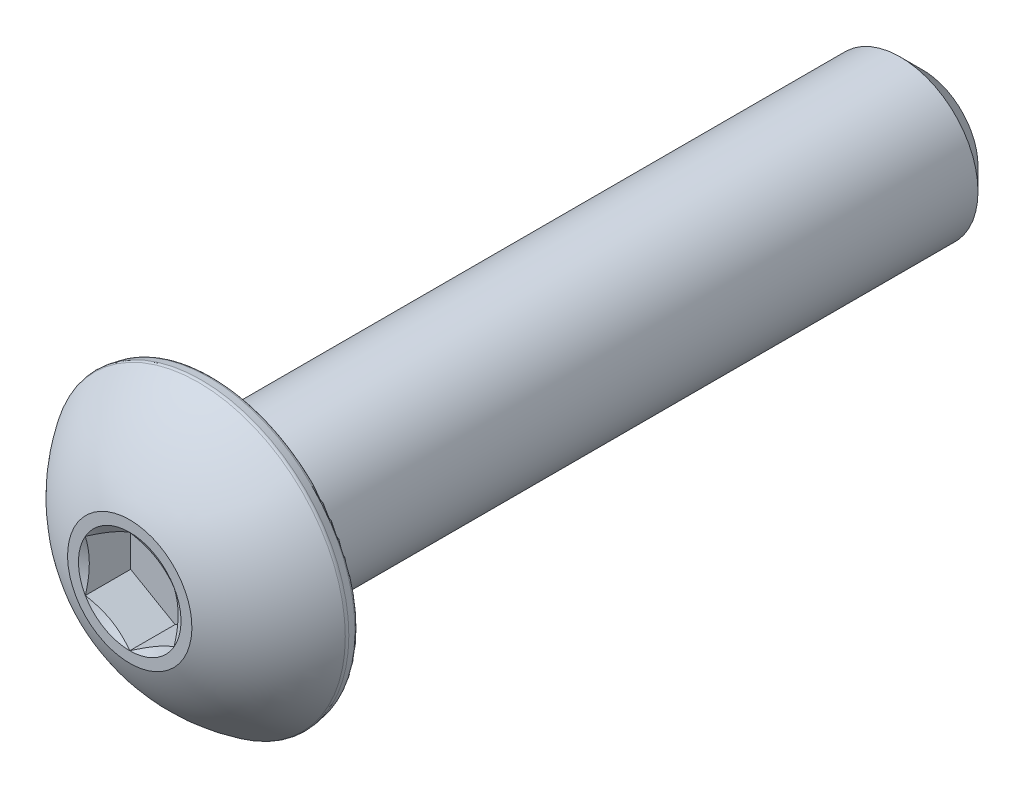
ISO-10303-21;
HEADER;
FILE_DESCRIPTION(('STEP AP214'),'2;1');
FILE_NAME('part.step','',(''),(''),'','','');
FILE_SCHEMA(('AUTOMOTIVE_DESIGN { 1 0 10303 214 1 1 1 1 }'));
ENDSEC;
DATA;
#1=APPLICATION_CONTEXT('core data for automotive mechanical design processes');
#2=APPLICATION_PROTOCOL_DEFINITION('international standard','automotive_design',2000,#1);
#3=PRODUCT_CONTEXT('',#1,'mechanical');
#4=PRODUCT('Part','Part','',(#3));
#5=PRODUCT_RELATED_PRODUCT_CATEGORY('part','',(#4));
#6=PRODUCT_DEFINITION_FORMATION('','',#4);
#7=PRODUCT_DEFINITION_CONTEXT('part definition',#1,'design');
#8=PRODUCT_DEFINITION('design','',#6,#7);
#9=PRODUCT_DEFINITION_SHAPE('','',#8);
#10=(LENGTH_UNIT() NAMED_UNIT(*) SI_UNIT(.MILLI.,.METRE.));
#11=(NAMED_UNIT(*) PLANE_ANGLE_UNIT() SI_UNIT($,.RADIAN.));
#12=(NAMED_UNIT(*) SI_UNIT($,.STERADIAN.) SOLID_ANGLE_UNIT());
#13=UNCERTAINTY_MEASURE_WITH_UNIT(LENGTH_MEASURE(1.E-05),#10,'distance_accuracy_value','');
#14=(GEOMETRIC_REPRESENTATION_CONTEXT(3) GLOBAL_UNCERTAINTY_ASSIGNED_CONTEXT((#13)) GLOBAL_UNIT_ASSIGNED_CONTEXT((#10,
#11,#12)) REPRESENTATION_CONTEXT('',''));
#15=CARTESIAN_POINT('',(0.,0.,0.));
#16=DIRECTION('',(0.,0.,1.));
#17=DIRECTION('',(1.,0.,0.));
#18=AXIS2_PLACEMENT_3D('',#15,#16,#17);
#19=CARTESIAN_POINT('',(0.,0.,10.6299));
#20=DIRECTION('',(0.,0.,-1.));
#21=DIRECTION('',(-1.,0.,0.));
#22=AXIS2_PLACEMENT_3D('',#19,#20,#21);
#23=PLANE('',#22);
#24=CARTESIAN_POINT('',(0.,0.,10.6299));
#25=DIRECTION('',(0.,0.,1.));
#26=DIRECTION('',(1.,0.,0.));
#27=AXIS2_PLACEMENT_3D('',#24,#25,#26);
#28=CIRCLE('',#27,1.3748153285078);
#29=CARTESIAN_POINT('',(-1.190625,0.687407664253898,10.6299));
#30=VERTEX_POINT('',#29);
#31=CARTESIAN_POINT('',(-1.190625,-0.687407664253898,10.6299));
#32=VERTEX_POINT('',#31);
#33=EDGE_CURVE('E95',#30,#32,#28,.T.);
#34=ORIENTED_EDGE('',*,*,#33,.F.);
#35=CARTESIAN_POINT('',(0.,1.3748153285078,10.6299));
#36=VERTEX_POINT('',#35);
#37=EDGE_CURVE('E104',#36,#30,#28,.T.);
#38=ORIENTED_EDGE('',*,*,#37,.F.);
#39=CARTESIAN_POINT('',(1.190625,0.687407664253899,10.6299));
#40=VERTEX_POINT('',#39);
#41=EDGE_CURVE('E55',#40,#36,#28,.T.);
#42=ORIENTED_EDGE('',*,*,#41,.F.);
#43=CARTESIAN_POINT('',(1.190625,-0.687407664253898,10.6299));
#44=VERTEX_POINT('',#43);
#45=EDGE_CURVE('E62',#44,#40,#28,.T.);
#46=ORIENTED_EDGE('',*,*,#45,.F.);
#47=CARTESIAN_POINT('',(0.,-1.3748153285078,10.6299));
#48=VERTEX_POINT('',#47);
#49=EDGE_CURVE('E137',#48,#44,#28,.T.);
#50=ORIENTED_EDGE('',*,*,#49,.F.);
#51=EDGE_CURVE('E105',#32,#48,#28,.T.);
#52=ORIENTED_EDGE('',*,*,#51,.F.);
#53=EDGE_LOOP('',(#34,#38,#42,#46,#50,#52));
#54=FACE_BOUND('',#53,.T.);
#55=CARTESIAN_POINT('',(0.,0.,10.6299));
#56=DIRECTION('',(0.,0.,1.));
#57=DIRECTION('',(1.,0.,0.));
#58=AXIS2_PLACEMENT_3D('',#55,#56,#57);
#59=CIRCLE('',#58,1.666875);
#60=CARTESIAN_POINT('',(0.,1.666875,10.6299));
#61=VERTEX_POINT('',#60);
#62=EDGE_CURVE('E116',#61,#61,#59,.T.);
#63=ORIENTED_EDGE('',*,*,#62,.T.);
#64=EDGE_LOOP('',(#63));
#65=FACE_BOUND('',#64,.T.);
#66=ADVANCED_FACE('F41',(#54,#65),#23,.F.);
#67=CARTESIAN_POINT('',(0.,0.,6.25093967799189));
#68=DIRECTION('',(0.,0.,1.));
#69=DIRECTION('',(0.,1.,0.));
#70=AXIS2_PLACEMENT_3D('',#67,#68,#69);
#71=SPHERICAL_SURFACE('',#70,4.68548458191321);
#72=CARTESIAN_POINT('',(0.,0.,8.78825331018233));
#73=DIRECTION('',(0.,0.,-1.));
#74=DIRECTION('',(-1.,0.,0.));
#75=AXIS2_PLACEMENT_3D('',#72,#73,#74);
#76=CIRCLE('',#75,3.93901070057533);
#77=CARTESIAN_POINT('',(0.,3.93901070057533,8.78825331018233));
#78=VERTEX_POINT('',#77);
#79=EDGE_CURVE('E115',#78,#78,#76,.F.);
#80=CARTESIAN_POINT('',(0.,3.93901070057533,8.78825331018233));
#81=CARTESIAN_POINT('',(0.,3.92223208961816,8.81430106822995));
#82=CARTESIAN_POINT('',(0.,3.90519503662693,8.84018234907335));
#83=CARTESIAN_POINT('',(0.,3.87061090971434,8.89160187738651));
#84=CARTESIAN_POINT('',(0.,3.85306383579298,8.91714012485627));
#85=CARTESIAN_POINT('',(0.,3.81746653015812,8.96786350745697));
#86=CARTESIAN_POINT('',(0.,3.79941629844462,8.99304864258791));
#87=CARTESIAN_POINT('',(0.,3.7628197921601,9.04305589668405));
#88=CARTESIAN_POINT('',(0.,3.74427351758908,9.06787801564924));
#89=CARTESIAN_POINT('',(0.,3.70669222132832,9.11714946675749));
#90=CARTESIAN_POINT('',(0.,3.68765719963858,9.14159879890055));
#91=CARTESIAN_POINT('',(0.,3.64910590108429,9.19011505501342));
#92=CARTESIAN_POINT('',(0.,3.62958962421973,9.21418197898323));
#93=CARTESIAN_POINT('',(0.,3.59008349562035,9.26192394719724));
#94=CARTESIAN_POINT('',(0.,3.57009364388554,9.28559899144144));
#95=CARTESIAN_POINT('',(0.,3.52964823250023,9.33254788306045));
#96=CARTESIAN_POINT('',(0.,3.50919267284974,9.35582173043525));
#97=CARTESIAN_POINT('',(0.,3.46782389579017,9.40195906901051));
#98=CARTESIAN_POINT('',(0.,3.44691067838108,9.42482256021097));
#99=CARTESIAN_POINT('',(0.,3.40463481608998,9.47013018863941));
#100=CARTESIAN_POINT('',(0.,3.38327217120797,9.49257432586738));
#101=CARTESIAN_POINT('',(0.,3.34010586112107,9.53703441358357));
#102=CARTESIAN_POINT('',(0.,3.31830219591619,9.55905036407178));
#103=CARTESIAN_POINT('',(0.,3.27426242589612,9.60264541405265));
#104=CARTESIAN_POINT('',(0.,3.25202632108095,9.6242245135453));
#105=CARTESIAN_POINT('',(0.,3.20713042273675,9.6669373691993));
#106=CARTESIAN_POINT('',(0.,3.18447062920773,9.68807112536066));
#107=CARTESIAN_POINT('',(0.,3.13873627107272,9.72988497727879));
#108=CARTESIAN_POINT('',(0.,3.11566170646674,9.75056507303558));
#109=CARTESIAN_POINT('',(0.,3.06910688704556,9.79146346560686));
#110=CARTESIAN_POINT('',(0.,3.04562663223037,9.81168176242135));
#111=CARTESIAN_POINT('',(0.,2.99826967291565,9.85164860030874));
#112=CARTESIAN_POINT('',(0.,2.97439296841613,9.87139714138165));
#113=CARTESIAN_POINT('',(0.,2.92625250627825,9.91041669585635));
#114=CARTESIAN_POINT('',(0.,2.90198874863989,9.92968770925815));
#115=CARTESIAN_POINT('',(0.,2.85308372909244,9.96774462438952));
#116=CARTESIAN_POINT('',(0.,2.82844246718335,9.98653052611909));
#117=CARTESIAN_POINT('',(0.,2.77879213652727,10.0236098248179));
#118=CARTESIAN_POINT('',(0.,2.75378306778029,10.0419032217871));
#119=CARTESIAN_POINT('',(0.,2.70340696562961,10.0779903116997));
#120=CARTESIAN_POINT('',(0.,2.67803993222592,10.095784004643));
#121=CARTESIAN_POINT('',(0.,2.62695788381803,10.130864683894));
#122=CARTESIAN_POINT('',(0.,2.60124286881384,10.1481516702016));
#123=CARTESIAN_POINT('',(0.,2.54947497720743,10.1822121329829));
#124=CARTESIAN_POINT('',(0.,2.52342210060522,10.1989856094567));
#125=CARTESIAN_POINT('',(0.,2.47098873876866,10.2320124514608));
#126=CARTESIAN_POINT('',(0.,2.44460825353431,10.2482658169912));
#127=CARTESIAN_POINT('',(0.,2.39153005632858,10.2802460406873));
#128=CARTESIAN_POINT('',(0.,2.3648323443572,10.2959728988531));
#129=CARTESIAN_POINT('',(0.,2.31113020041292,10.326893918597));
#130=CARTESIAN_POINT('',(0.,2.28412576844003,10.3420880801751));
#131=CARTESIAN_POINT('',(0.,2.22982081194522,10.3719377271826));
#132=CARTESIAN_POINT('',(0.,2.20252028742329,10.3865932126121));
#133=CARTESIAN_POINT('',(0.,2.14763388977497,10.4153597396713));
#134=CARTESIAN_POINT('',(0.,2.12004801664857,10.4294707813011));
#135=CARTESIAN_POINT('',(0.,2.06460177815826,10.4571428676826));
#136=CARTESIAN_POINT('',(0.,2.03674141279435,10.4707039124344));
#137=CARTESIAN_POINT('',(0.,1.98075715375427,10.4972706672736));
#138=CARTESIAN_POINT('',(0.,1.9526332600781,10.510276377361));
#139=CARTESIAN_POINT('',(0.,1.89613301379031,10.5357273479493));
#140=CARTESIAN_POINT('',(0.,1.86775666117869,10.5481726084502));
#141=CARTESIAN_POINT('',(0.,1.81076265925148,10.5724977694001));
#142=CARTESIAN_POINT('',(0.,1.78214500993589,10.5843776698491));
#143=CARTESIAN_POINT('',(0.,1.72467969604834,10.6075674828294));
#144=CARTESIAN_POINT('',(0.,1.69583203147637,10.6188773953606));
#145=CARTESIAN_POINT('',(0.,1.666875,10.6299));
#146=B_SPLINE_CURVE_WITH_KNOTS('',3,(#80,#81,#82,#83,#84,#85,#86,#87,#88,#89,#90,#91,#92,#93,
#94,#95,#96,#97,#98,#99,#100,#101,#102,#103,#104,#105,#106,#107,#108,#109,#110,#111,#112,#113,
#114,#115,#116,#117,#118,#119,#120,#121,#122,#123,#124,#125,#126,#127,#128,#129,#130,#131,#132,
#133,#134,#135,#136,#137,#138,#139,#140,#141,#142,#143,#144,#145),.UNSPECIFIED.,.F.,.F.,(4,2,2,
2,2,2,2,2,2,2,2,2,2,2,2,2,2,2,2,2,2,2,2,2,2,2,2,2,2,2,2,2,4),(0.,0.0929504359276324,
0.185900871855264,0.278851307782895,0.371801743710527,0.464752179638159,0.55770261556579,
0.650653051493421,0.743603487421053,0.836553923348683,0.929504359276316,1.02245479520395,
1.11540523113158,1.20835566705921,1.30130610298684,1.39425653891447,1.4872069748421,
1.58015741076974,1.67310784669737,1.766058282625,1.85900871855263,1.95195915448026,
2.04490959040789,2.13786002633552,2.23081046226315,2.32376089819079,2.41671133411842,
2.50966177004605,2.60261220597368,2.69556264190131,2.78851307782894,2.88146351375658,
2.97441394968421),.UNSPECIFIED.);
#147=EDGE_CURVE('BSEAM210',#78,#61,#146,.T.);
#148=ORIENTED_EDGE('',*,*,#79,.T.);
#149=ORIENTED_EDGE('',*,*,#62,.F.);
#150=ORIENTED_EDGE('',*,*,#147,.T.);
#151=ORIENTED_EDGE('',*,*,#147,.F.);
#152=EDGE_LOOP('',(#148,#150,#149,#151));
#153=FACE_BOUND('',#152,.T.);
#154=ADVANCED_FACE('F210',(#153),#71,.T.);
#155=CARTESIAN_POINT('',(0.,0.,8.4201));
#156=DIRECTION('',(0.,0.,1.));
#157=DIRECTION('',(1.,0.,0.));
#158=AXIS2_PLACEMENT_3D('',#155,#156,#157);
#159=CONICAL_SURFACE('',#158,3.90395289570457,0.17453292519943);
#160=CARTESIAN_POINT('',(0.,0.,8.70923367028727));
#161=DIRECTION('',(0.,0.,-1.));
#162=DIRECTION('',(-1.,0.,0.));
#163=AXIS2_PLACEMENT_3D('',#160,#161,#162);
#164=CIRCLE('',#163,3.95493496280748);
#165=CARTESIAN_POINT('',(-3.95493496280748,0.,8.70923367028727));
#166=VERTEX_POINT('',#165);
#167=EDGE_CURVE('E49',#166,#166,#164,.T.);
#168=ORIENTED_EDGE('',*,*,#167,.T.);
#169=EDGE_LOOP('',(#168));
#170=FACE_BOUND('',#169,.T.);
#171=CARTESIAN_POINT('',(0.,0.,8.51140361284958));
#172=DIRECTION('',(0.,0.,-1.));
#173=DIRECTION('',(-1.,0.,0.));
#174=AXIS2_PLACEMENT_3D('',#171,#172,#173);
#175=CIRCLE('',#174,3.92005218608611);
#176=CARTESIAN_POINT('',(-3.92005218608611,0.,8.51140361284958));
#177=VERTEX_POINT('',#176);
#178=EDGE_CURVE('E232',#177,#177,#175,.F.);
#179=ORIENTED_EDGE('',*,*,#178,.T.);
#180=EDGE_LOOP('',(#179));
#181=FACE_BOUND('',#180,.T.);
#182=ADVANCED_FACE('F215',(#170,#181),#159,.T.);
#183=CARTESIAN_POINT('',(0.,3.90395289570457,8.4201));
#184=DIRECTION('',(0.,0.,1.));
#185=DIRECTION('',(1.,0.,0.));
#186=AXIS2_PLACEMENT_3D('',#183,#184,#185);
#187=PLANE('',#186);
#188=CARTESIAN_POINT('',(0.,0.,8.4201));
#189=DIRECTION('',(0.,0.,1.));
#190=DIRECTION('',(1.,0.,0.));
#191=AXIS2_PLACEMENT_3D('',#188,#189,#190);
#192=CIRCLE('',#191,3.81124077745579);
#193=CARTESIAN_POINT('',(3.81124077745579,0.,8.4201));
#194=VERTEX_POINT('',#193);
#195=EDGE_CURVE('E11',#194,#194,#192,.F.);
#196=ORIENTED_EDGE('',*,*,#195,.T.);
#197=EDGE_LOOP('',(#196));
#198=FACE_BOUND('',#197,.T.);
#199=CARTESIAN_POINT('',(0.,0.,8.4201));
#200=DIRECTION('',(0.,0.,1.));
#201=DIRECTION('',(1.,0.,0.));
#202=AXIS2_PLACEMENT_3D('',#199,#200,#201);
#203=CIRCLE('',#202,2.0828);
#204=CARTESIAN_POINT('',(2.0828,0.,8.4201));
#205=VERTEX_POINT('',#204);
#206=EDGE_CURVE('E297',#205,#205,#203,.T.);
#207=ORIENTED_EDGE('',*,*,#206,.T.);
#208=EDGE_LOOP('',(#207));
#209=FACE_BOUND('',#208,.T.);
#210=ADVANCED_FACE('F238',(#198,#209),#187,.F.);
#211=CARTESIAN_POINT('',(0.,0.,10.6299));
#212=DIRECTION('',(0.,0.,1.));
#213=DIRECTION('',(1.,0.,0.));
#214=AXIS2_PLACEMENT_3D('',#211,#212,#213);
#215=CYLINDRICAL_SURFACE('',#214,2.0828);
#216=ORIENTED_EDGE('',*,*,#206,.F.);
#217=EDGE_LOOP('',(#216));
#218=FACE_BOUND('',#217,.T.);
#219=CARTESIAN_POINT('',(0.,0.,-10.0345875));
#220=DIRECTION('',(0.,0.,1.));
#221=DIRECTION('',(1.,0.,0.));
#222=AXIS2_PLACEMENT_3D('',#219,#220,#221);
#223=CIRCLE('',#222,2.0828);
#224=CARTESIAN_POINT('',(2.0828,0.,-10.0345875));
#225=VERTEX_POINT('',#224);
#226=EDGE_CURVE('E294',#225,#225,#223,.T.);
#227=ORIENTED_EDGE('',*,*,#226,.T.);
#228=EDGE_LOOP('',(#227));
#229=FACE_BOUND('',#228,.T.);
#230=ADVANCED_FACE('F244',(#218,#229),#215,.T.);
#231=CARTESIAN_POINT('',(0.,0.,-10.6299));
#232=DIRECTION('',(0.,0.,1.));
#233=DIRECTION('',(1.,0.,0.));
#234=AXIS2_PLACEMENT_3D('',#231,#232,#233);
#235=CONICAL_SURFACE('',#234,1.4874875,0.785398163397442);
#236=ORIENTED_EDGE('',*,*,#226,.F.);
#237=EDGE_LOOP('',(#236));
#238=FACE_BOUND('',#237,.T.);
#239=CARTESIAN_POINT('',(0.,0.,-10.6299));
#240=DIRECTION('',(0.,0.,1.));
#241=DIRECTION('',(1.,0.,0.));
#242=AXIS2_PLACEMENT_3D('',#239,#240,#241);
#243=CIRCLE('',#242,1.4874875);
#244=CARTESIAN_POINT('',(1.4874875,0.,-10.6299));
#245=VERTEX_POINT('',#244);
#246=EDGE_CURVE('E282',#245,#245,#243,.T.);
#247=ORIENTED_EDGE('',*,*,#246,.T.);
#248=EDGE_LOOP('',(#247));
#249=FACE_BOUND('',#248,.T.);
#250=ADVANCED_FACE('F250',(#238,#249),#235,.T.);
#251=CARTESIAN_POINT('',(0.,0.,-10.6299));
#252=DIRECTION('',(0.,0.,1.));
#253=DIRECTION('',(1.,0.,0.));
#254=AXIS2_PLACEMENT_3D('',#251,#252,#253);
#255=PLANE('',#254);
#256=ORIENTED_EDGE('',*,*,#246,.F.);
#257=EDGE_LOOP('',(#256));
#258=FACE_BOUND('',#257,.T.);
#259=ADVANCED_FACE('F254',(#258),#255,.F.);
#260=CARTESIAN_POINT('',(0.,0.,10.6299));
#261=DIRECTION('',(0.,0.,1.));
#262=DIRECTION('',(1.,0.,0.));
#263=AXIS2_PLACEMENT_3D('',#260,#261,#262);
#264=CONICAL_SURFACE('',#263,1.3748153285078,1.0471975511966);
#265=ORIENTED_EDGE('',*,*,#51,.T.);
#266=CARTESIAN_POINT('',(-1.190825,-0.68729219420006,10.6299666750649));
#267=CARTESIAN_POINT('',(-1.13850086640794,-0.717501546814549,10.6125158911719));
#268=CARTESIAN_POINT('',(-1.08572507911365,-0.747971661815603,10.5966444802597));
#269=CARTESIAN_POINT('',(-0.979259451985808,-0.809439620297305,10.5689394897393));
#270=CARTESIAN_POINT('',(-0.925567719041629,-0.840438556765884,10.5571157133569));
#271=CARTESIAN_POINT('',(-0.818849729284476,-0.902052216879552,10.5387085267766));
#272=CARTESIAN_POINT('',(-0.765839901547054,-0.932657455193448,10.5320026367973));
#273=CARTESIAN_POINT('',(-0.659570550745401,-0.994012093485389,10.5239941608559));
#274=CARTESIAN_POINT('',(-0.606311414481164,-1.02476127014435,10.5226849464003));
#275=CARTESIAN_POINT('',(-0.506776071312107,-1.08222802731689,10.5253944946182));
#276=CARTESIAN_POINT('',(-0.460485037506221,-1.10895416814578,10.5287479670539));
#277=CARTESIAN_POINT('',(-0.36820458567917,-1.16223231184907,10.5393808803557));
#278=CARTESIAN_POINT('',(-0.322215487336751,-1.18878413015686,10.5466639607648));
#279=CARTESIAN_POINT('',(-0.22974444840945,-1.24217230937378,10.5648728190617));
#280=CARTESIAN_POINT('',(-0.183274224005285,-1.26900190594283,10.5758758583194));
#281=CARTESIAN_POINT('',(-0.0910272545831359,-1.32226071857063,10.6008490907767));
#282=CARTESIAN_POINT('',(-0.0452493258233879,-1.34869061806301,10.6148134081649));
#283=CARTESIAN_POINT('',(0.000200000000000024,-1.37493079856163,10.6299666750649));
#284=B_SPLINE_CURVE_WITH_KNOTS('',3,(#266,#267,#268,#269,#270,#271,#272,#273,#274,#275,#276,
#277,#278,#279,#280,#281,#282,#283),.UNSPECIFIED.,.F.,.F.,(4,2,2,2,2,2,2,2,4),(0.,
0.188739408275265,0.377932755052259,0.562442610563905,0.746725773280444,0.907244981861692,
1.06791311672804,1.23214725548008,1.39605851764637),.UNSPECIFIED.);
#285=EDGE_CURVE('E110',#32,#48,#284,.T.);
#286=ORIENTED_EDGE('',*,*,#285,.F.);
#287=EDGE_LOOP('',(#265,#286));
#288=FACE_BOUND('',#287,.T.);
#289=ADVANCED_FACE('F111',(#288),#264,.F.);
#290=ORIENTED_EDGE('',*,*,#49,.T.);
#291=CARTESIAN_POINT('',(-0.00019999999999944,-1.37493079856163,10.6299666750649));
#292=CARTESIAN_POINT('',(0.0521241335920584,-1.34472144594715,10.6125158911719));
#293=CARTESIAN_POINT('',(0.104899920886351,-1.31425133094609,10.5966444802597));
#294=CARTESIAN_POINT('',(0.211365548014193,-1.25278337246439,10.5689394897393));
#295=CARTESIAN_POINT('',(0.265057280958371,-1.22178443599581,10.5571157133569));
#296=CARTESIAN_POINT('',(0.371775270715524,-1.16017077588214,10.5387085267766));
#297=CARTESIAN_POINT('',(0.424785098452945,-1.12956553756825,10.5320026367973));
#298=CARTESIAN_POINT('',(0.531054449254599,-1.06821089927631,10.5239941608559));
#299=CARTESIAN_POINT('',(0.584313585518836,-1.03746172261734,10.5226849464003));
#300=CARTESIAN_POINT('',(0.683848928687892,-0.979994965444805,10.5253944946182));
#301=CARTESIAN_POINT('',(0.730139962493779,-0.95326882461591,10.5287479670539));
#302=CARTESIAN_POINT('',(0.822420414320829,-0.899990680912622,10.5393808803557));
#303=CARTESIAN_POINT('',(0.868409512663248,-0.873438862604838,10.5466639607648));
#304=CARTESIAN_POINT('',(0.96088055159055,-0.820050683387916,10.5648728190617));
#305=CARTESIAN_POINT('',(1.00735077599471,-0.793221086818869,10.5758758583194));
#306=CARTESIAN_POINT('',(1.09959774541686,-0.739962274191064,10.6008490907767));
#307=CARTESIAN_POINT('',(1.14537567417661,-0.71353237469868,10.6148134081649));
#308=CARTESIAN_POINT('',(1.190825,-0.68729219420006,10.6299666750649));
#309=B_SPLINE_CURVE_WITH_KNOTS('',3,(#291,#292,#293,#294,#295,#296,#297,#298,#299,#300,#301,
#302,#303,#304,#305,#306,#307,#308),.UNSPECIFIED.,.F.,.F.,(4,2,2,2,2,2,2,2,4),(0.,
0.188739408275265,0.377932755052259,0.562442610563904,0.746725773280443,0.907244981861691,
1.06791311672804,1.23214725548008,1.39605851764637),.UNSPECIFIED.);
#310=EDGE_CURVE('E139',#48,#44,#309,.T.);
#311=ORIENTED_EDGE('',*,*,#310,.F.);
#312=EDGE_LOOP('',(#290,#311));
#313=FACE_BOUND('',#312,.T.);
#314=ADVANCED_FACE('F323',(#313),#264,.F.);
#315=ORIENTED_EDGE('',*,*,#45,.T.);
#316=CARTESIAN_POINT('',(1.190625,-1.78015716084731,11.0726163909627));
#317=CARTESIAN_POINT('',(1.190625,-1.72874189247822,11.0479488312487));
#318=CARTESIAN_POINT('',(1.190625,-1.6772013395888,11.0235381587869));
#319=CARTESIAN_POINT('',(1.190625,-1.57380296702255,10.9753745835681));
#320=CARTESIAN_POINT('',(1.190625,-1.5219450922722,10.9516217991873));
#321=CARTESIAN_POINT('',(1.190625,-1.41754804050941,10.9047852951481));
#322=CARTESIAN_POINT('',(1.190625,-1.36500663889643,10.8817065080861));
#323=CARTESIAN_POINT('',(1.190625,-1.25948270112518,10.83658924438));
#324=CARTESIAN_POINT('',(1.190625,-1.20650018807302,10.8145507136439));
#325=CARTESIAN_POINT('',(1.190625,-1.0439847017939,10.749251437107));
#326=CARTESIAN_POINT('',(1.190625,-0.933604354875446,10.7080585999984));
#327=CARTESIAN_POINT('',(1.190625,-0.710006074870551,10.6347509566672));
#328=CARTESIAN_POINT('',(1.190625,-0.596796359557364,10.6026125823643));
#329=CARTESIAN_POINT('',(1.190625,-0.424696051921822,10.5653391876198));
#330=CARTESIAN_POINT('',(1.190625,-0.36700324648945,10.5547418918817));
#331=CARTESIAN_POINT('',(1.190625,-0.25097045938438,10.5379152301237));
#332=CARTESIAN_POINT('',(1.190625,-0.192630521716883,10.5316855689305));
#333=CARTESIAN_POINT('',(1.190625,-0.0763262923912431,10.5241712860139));
#334=CARTESIAN_POINT('',(1.190625,-0.0183658750620588,10.5228283093093));
#335=CARTESIAN_POINT('',(1.190625,0.0974591065511632,10.525045183335));
#336=CARTESIAN_POINT('',(1.190625,0.155323664677828,10.5286053376499));
#337=CARTESIAN_POINT('',(1.190625,0.298095905943349,10.543125365062));
#338=CARTESIAN_POINT('',(1.190625,0.382726931127662,10.5568063374102));
#339=CARTESIAN_POINT('',(1.190625,0.550343214187449,10.5920856084269));
#340=CARTESIAN_POINT('',(1.190625,0.633326360920117,10.6136934493732));
#341=CARTESIAN_POINT('',(1.190625,0.757436786068249,10.6506049240668));
#342=CARTESIAN_POINT('',(1.190625,0.799205604113746,10.6638308548871));
#343=CARTESIAN_POINT('',(1.190625,0.882308453548577,10.6915061907157));
#344=CARTESIAN_POINT('',(1.190625,0.923642738420154,10.7059548321817));
#345=CARTESIAN_POINT('',(1.190625,1.00593175942181,10.7358657527241));
#346=CARTESIAN_POINT('',(1.190625,1.04688656299308,10.7513278475876));
#347=CARTESIAN_POINT('',(1.190625,1.12847346020313,10.7830984275059));
#348=CARTESIAN_POINT('',(1.190625,1.16910549797315,10.7994070555615));
#349=CARTESIAN_POINT('',(1.190625,1.27282063126956,10.8420802732998));
#350=CARTESIAN_POINT('',(1.190625,1.33569634213378,10.8689483623053));
#351=CARTESIAN_POINT('',(1.190625,1.46087997262867,10.9239797402463));
#352=CARTESIAN_POINT('',(1.190625,1.52318784930323,10.9521431262111));
#353=CARTESIAN_POINT('',(1.190625,1.70944892938504,11.038119621741));
#354=CARTESIAN_POINT('',(1.190625,1.83271877725917,11.0974102545833));
#355=CARTESIAN_POINT('',(1.190625,2.07820533826024,11.2184781593295));
#356=CARTESIAN_POINT('',(1.190625,2.20042057042498,11.2802583985654));
#357=CARTESIAN_POINT('',(1.190625,2.44401368525769,11.405407444744));
#358=CARTESIAN_POINT('',(1.190625,2.56539167188514,11.4687760497633));
#359=CARTESIAN_POINT('',(1.190625,2.79613899481932,11.5905747280009));
#360=CARTESIAN_POINT('',(1.190625,2.90556045514281,11.6489063950187));
#361=CARTESIAN_POINT('',(1.190625,3.1240513999792,11.766234357044));
#362=CARTESIAN_POINT('',(1.190625,3.23312087127289,11.8252306766477));
#363=CARTESIAN_POINT('',(1.190625,3.45071155662787,11.9435705743432));
#364=CARTESIAN_POINT('',(1.190625,3.559233459568,12.0029128874905));
#365=CARTESIAN_POINT('',(1.190625,3.77605786075387,12.1219837449305));
#366=CARTESIAN_POINT('',(1.190625,3.8843603701844,12.1817122688482));
#367=CARTESIAN_POINT('',(1.190625,3.99258405655482,12.2415824170705));
#368=B_SPLINE_CURVE_WITH_KNOTS('',3,(#316,#317,#318,#319,#320,#321,#322,#323,#324,#325,#326,
#327,#328,#329,#330,#331,#332,#333,#334,#335,#336,#337,#338,#339,#340,#341,#342,#343,#344,#345,
#346,#347,#348,#349,#350,#351,#352,#353,#354,#355,#356,#357,#358,#359,#360,#361,#362,#363,#364,
#365,#366,#367),.UNSPECIFIED.,.F.,.F.,(4,2,2,2,2,2,2,2,2,2,2,2,2,2,2,2,2,2,2,2,2,2,2,2,2,4),(0.,
0.17108131287706,0.342193211629956,0.514343081226402,0.686483989377056,1.03974142308361,
1.39207067530311,1.56790731691955,1.74373207400732,1.91745017583682,2.09117903416894,
2.34784044669786,2.60481184474485,2.73623570080653,2.86757808421725,2.99889665970536,
3.13023749087939,3.33534372267026,3.54046534385521,3.95077633679528,4.36159174347165,
4.77235518684733,5.14434822446085,5.51635507365502,5.88741571072504,6.25845692924088),.UNSPECIFIED.);
#369=EDGE_CURVE('E148',#44,#40,#368,.T.);
#370=ORIENTED_EDGE('',*,*,#369,.F.);
#371=EDGE_LOOP('',(#315,#370));
#372=FACE_BOUND('',#371,.T.);
#373=ADVANCED_FACE('F319',(#372),#264,.F.);
#374=ORIENTED_EDGE('',*,*,#41,.T.);
#375=CARTESIAN_POINT('',(1.190825,0.687292194200061,10.6299666750649));
#376=CARTESIAN_POINT('',(1.13850086640794,0.717501546814549,10.6125158911719));
#377=CARTESIAN_POINT('',(1.08572507911365,0.747971661815603,10.5966444802597));
#378=CARTESIAN_POINT('',(0.979259451985808,0.809439620297305,10.5689394897393));
#379=CARTESIAN_POINT('',(0.92556771904163,0.840438556765884,10.5571157133569));
#380=CARTESIAN_POINT('',(0.818849729284477,0.902052216879552,10.5387085267766));
#381=CARTESIAN_POINT('',(0.765839901547055,0.932657455193448,10.5320026367973));
#382=CARTESIAN_POINT('',(0.659570550745401,0.99401209348539,10.5239941608559));
#383=CARTESIAN_POINT('',(0.606311414481165,1.02476127014435,10.5226849464003));
#384=CARTESIAN_POINT('',(0.506776071312108,1.08222802731689,10.5253944946182));
#385=CARTESIAN_POINT('',(0.460485037506222,1.10895416814578,10.5287479670539));
#386=CARTESIAN_POINT('',(0.368204585679171,1.16223231184907,10.5393808803557));
#387=CARTESIAN_POINT('',(0.322215487336752,1.18878413015686,10.5466639607648));
#388=CARTESIAN_POINT('',(0.22974444840945,1.24217230937378,10.5648728190617));
#389=CARTESIAN_POINT('',(0.183274224005285,1.26900190594283,10.5758758583194));
#390=CARTESIAN_POINT('',(0.0910272545831358,1.32226071857063,10.6008490907767));
#391=CARTESIAN_POINT('',(0.0452493258233876,1.34869061806301,10.6148134081649));
#392=CARTESIAN_POINT('',(-0.000200000000000346,1.37493079856163,10.6299666750649));
#393=B_SPLINE_CURVE_WITH_KNOTS('',3,(#375,#376,#377,#378,#379,#380,#381,#382,#383,#384,#385,
#386,#387,#388,#389,#390,#391,#392),.UNSPECIFIED.,.F.,.F.,(4,2,2,2,2,2,2,2,4),(0.,
0.188739408275265,0.377932755052259,0.562442610563905,0.746725773280444,0.907244981861692,
1.06791311672804,1.23214725548008,1.39605851764637),.UNSPECIFIED.);
#394=EDGE_CURVE('E175',#40,#36,#393,.T.);
#395=ORIENTED_EDGE('',*,*,#394,.F.);
#396=EDGE_LOOP('',(#374,#395));
#397=FACE_BOUND('',#396,.T.);
#398=ADVANCED_FACE('F315',(#397),#264,.F.);
#399=ORIENTED_EDGE('',*,*,#37,.T.);
#400=CARTESIAN_POINT('',(0.000199999999999814,1.37493079856163,10.6299666750649));
#401=CARTESIAN_POINT('',(-0.0521241335920577,1.34472144594715,10.6125158911719));
#402=CARTESIAN_POINT('',(-0.10489992088635,1.31425133094609,10.5966444802597));
#403=CARTESIAN_POINT('',(-0.211365548014192,1.25278337246439,10.5689394897393));
#404=CARTESIAN_POINT('',(-0.265057280958371,1.22178443599581,10.5571157133569));
#405=CARTESIAN_POINT('',(-0.371775270715524,1.16017077588214,10.5387085267766));
#406=CARTESIAN_POINT('',(-0.424785098452945,1.12956553756825,10.5320026367973));
#407=CARTESIAN_POINT('',(-0.531054449254599,1.06821089927631,10.5239941608559));
#408=CARTESIAN_POINT('',(-0.584313585518836,1.03746172261734,10.5226849464003));
#409=CARTESIAN_POINT('',(-0.683848928687892,0.979994965444805,10.5253944946182));
#410=CARTESIAN_POINT('',(-0.730139962493779,0.95326882461591,10.5287479670539));
#411=CARTESIAN_POINT('',(-0.82242041432083,0.899990680912622,10.5393808803557));
#412=CARTESIAN_POINT('',(-0.868409512663249,0.873438862604838,10.5466639607648));
#413=CARTESIAN_POINT('',(-0.96088055159055,0.820050683387916,10.5648728190617));
#414=CARTESIAN_POINT('',(-1.00735077599471,0.79322108681887,10.5758758583194));
#415=CARTESIAN_POINT('',(-1.09959774541686,0.739962274191065,10.6008490907767));
#416=CARTESIAN_POINT('',(-1.14537567417661,0.71353237469868,10.6148134081649));
#417=CARTESIAN_POINT('',(-1.190825,0.68729219420006,10.6299666750649));
#418=B_SPLINE_CURVE_WITH_KNOTS('',3,(#400,#401,#402,#403,#404,#405,#406,#407,#408,#409,#410,
#411,#412,#413,#414,#415,#416,#417),.UNSPECIFIED.,.F.,.F.,(4,2,2,2,2,2,2,2,4),(0.,
0.188739408275265,0.37793275505226,0.562442610563905,0.746725773280444,0.907244981861693,
1.06791311672804,1.23214725548008,1.39605851764637),.UNSPECIFIED.);
#419=EDGE_CURVE('E126',#36,#30,#418,.T.);
#420=ORIENTED_EDGE('',*,*,#419,.F.);
#421=EDGE_LOOP('',(#399,#420));
#422=FACE_BOUND('',#421,.T.);
#423=ADVANCED_FACE('F162',(#422),#264,.F.);
#424=ORIENTED_EDGE('',*,*,#33,.T.);
#425=CARTESIAN_POINT('',(-1.190625,-1.78015716020704,11.0726163906554));
#426=CARTESIAN_POINT('',(-1.190625,-1.72874189185983,11.0479488309547));
#427=CARTESIAN_POINT('',(-1.190625,-1.67720133899231,11.0235381585061));
#428=CARTESIAN_POINT('',(-1.190625,-1.57380296646994,10.9753745833137));
#429=CARTESIAN_POINT('',(-1.190625,-1.52194509174156,10.951621798946));
#430=CARTESIAN_POINT('',(-1.190625,-1.41754804002315,10.9047852949331));
#431=CARTESIAN_POINT('',(-1.190625,-1.36500663843256,10.8817065078844));
#432=CARTESIAN_POINT('',(-1.190625,-1.25948270070629,10.8365892442043));
#433=CARTESIAN_POINT('',(-1.190625,-1.2065001876767,10.8145507134811));
#434=CARTESIAN_POINT('',(-1.190625,-1.04398470146779,10.7492514369833));
#435=CARTESIAN_POINT('',(-1.190625,-0.933604354597387,10.7080585999003));
#436=CARTESIAN_POINT('',(-1.190625,-0.710006074690724,10.6347509566151));
#437=CARTESIAN_POINT('',(-1.190625,-0.596796359427705,10.6026125823328));
#438=CARTESIAN_POINT('',(-1.190625,-0.424696051876904,10.5653391876118));
#439=CARTESIAN_POINT('',(-1.190625,-0.367003246478023,10.5547418918806));
#440=CARTESIAN_POINT('',(-1.190625,-0.25097045944064,10.5379152301313));
#441=CARTESIAN_POINT('',(-1.190625,-0.192630521807338,10.5316855689398));
#442=CARTESIAN_POINT('',(-1.190625,-0.0763262925494521,10.5241712860207));
#443=CARTESIAN_POINT('',(-1.190625,-0.0183658752538235,10.522828309312));
#444=CARTESIAN_POINT('',(-1.190625,0.097459106292918,10.5250451833237));
#445=CARTESIAN_POINT('',(-1.190625,0.155323664386658,10.528605337629));
#446=CARTESIAN_POINT('',(-1.190625,0.29809590559866,10.5431253650142));
#447=CARTESIAN_POINT('',(-1.190625,0.382726930762759,10.556806337346));
#448=CARTESIAN_POINT('',(-1.190625,0.550343213783403,10.5920856083292));
#449=CARTESIAN_POINT('',(-1.190625,0.633326360497145,10.6136934492585));
#450=CARTESIAN_POINT('',(-1.190625,0.75743678561691,10.6506049239269));
#451=CARTESIAN_POINT('',(-1.190625,0.799205603652769,10.6638308547387));
#452=CARTESIAN_POINT('',(-1.190625,0.882308453068415,10.6915061905507));
#453=CARTESIAN_POINT('',(-1.190625,0.923642737930446,10.7059548320084));
#454=CARTESIAN_POINT('',(-1.190625,1.00593175891306,10.7358657525345));
#455=CARTESIAN_POINT('',(-1.190625,1.04688656247483,10.75132784739));
#456=CARTESIAN_POINT('',(-1.190625,1.12847345966589,10.7830984272925));
#457=CARTESIAN_POINT('',(-1.190625,1.1691054974264,10.7994070553403));
#458=CARTESIAN_POINT('',(-1.190625,1.27282063071651,10.8420802730663));
#459=CARTESIAN_POINT('',(-1.190625,1.33569634158372,10.868948362068));
#460=CARTESIAN_POINT('',(-1.190625,1.4608799720842,10.9239797400025));
#461=CARTESIAN_POINT('',(-1.190625,1.52318784876137,10.9521431259645));
#462=CARTESIAN_POINT('',(-1.190625,1.70944892885062,11.0381196214873));
#463=CARTESIAN_POINT('',(-1.190625,1.83271877672913,11.0974102543263));
#464=CARTESIAN_POINT('',(-1.190625,2.07820533773844,11.2184781590678));
#465=CARTESIAN_POINT('',(-1.190625,2.20042056990702,11.2802583983021));
#466=CARTESIAN_POINT('',(-1.190625,2.44401368474694,11.4054074444787));
#467=CARTESIAN_POINT('',(-1.190625,2.56539167137775,11.4687760494975));
#468=CARTESIAN_POINT('',(-1.190625,2.79613899431499,11.5905747277329));
#469=CARTESIAN_POINT('',(-1.190625,2.90556045463821,11.6489063947491));
#470=CARTESIAN_POINT('',(-1.190625,3.12405139947394,11.7662343567714));
#471=CARTESIAN_POINT('',(-1.190625,3.23312087076723,11.8252306763737));
#472=CARTESIAN_POINT('',(-1.190625,3.45071155612091,11.9435705740664));
#473=CARTESIAN_POINT('',(-1.190625,3.55923345906017,12.0029128872124));
#474=CARTESIAN_POINT('',(-1.190625,3.77605786024419,12.1219837446499));
#475=CARTESIAN_POINT('',(-1.190625,3.88436036967376,12.1817122685663));
#476=CARTESIAN_POINT('',(-1.190625,3.99258405604319,12.2415824167874));
#477=B_SPLINE_CURVE_WITH_KNOTS('',3,(#425,#426,#427,#428,#429,#430,#431,#432,#433,#434,#435,
#436,#437,#438,#439,#440,#441,#442,#443,#444,#445,#446,#447,#448,#449,#450,#451,#452,#453,#454,
#455,#456,#457,#458,#459,#460,#461,#462,#463,#464,#465,#466,#467,#468,#469,#470,#471,#472,#473,
#474,#475,#476),.UNSPECIFIED.,.F.,.F.,(4,2,2,2,2,2,2,2,2,2,2,2,2,2,2,2,2,2,2,2,2,2,2,2,2,4),(0.,
0.171081312800698,0.342193211477216,0.514343080996251,0.686483989069503,1.03974142261425,
1.39207067467284,1.56790731618694,1.7437320731725,1.91745017490203,2.09117903313408,
2.34784044559532,2.60481184357443,2.73623569960086,2.86757808297636,2.99889665842932,
3.13023748956819,3.33534372136274,3.54046534255141,3.95077633549906,4.36159174218368,
4.7723551855675,5.144348223178,5.51635507236915,5.8874157094349,6.25845692794643),.UNSPECIFIED.);
#478=EDGE_CURVE('E99',#30,#32,#477,.F.);
#479=ORIENTED_EDGE('',*,*,#478,.F.);
#480=EDGE_LOOP('',(#424,#479));
#481=FACE_BOUND('',#480,.T.);
#482=ADVANCED_FACE('F97',(#481),#264,.F.);
#483=CARTESIAN_POINT('',(0.,0.,9.41451));
#484=DIRECTION('',(0.,0.,1.));
#485=DIRECTION('',(1.,0.,0.));
#486=AXIS2_PLACEMENT_3D('',#483,#484,#485);
#487=PLANE('',#486);
#488=DIRECTION('',(0.,-1.,0.));
#489=VECTOR('',#488,1.);
#490=CARTESIAN_POINT('',(-1.190625,0.687407664253898,9.41451));
#491=LINE('',#490,#489);
#492=CARTESIAN_POINT('',(-1.190625,0.687407664253898,9.41451));
#493=VERTEX_POINT('',#492);
#494=CARTESIAN_POINT('',(-1.190625,-0.687407664253898,9.41451));
#495=VERTEX_POINT('',#494);
#496=EDGE_CURVE('E125',#493,#495,#491,.T.);
#497=ORIENTED_EDGE('',*,*,#496,.T.);
#498=DIRECTION('',(0.866025403784439,-0.5,0.));
#499=VECTOR('',#498,1.);
#500=CARTESIAN_POINT('',(-1.190625,-0.687407664253898,9.41451));
#501=LINE('',#500,#499);
#502=CARTESIAN_POINT('',(0.,-1.3748153285078,9.41451));
#503=VERTEX_POINT('',#502);
#504=EDGE_CURVE('E130',#495,#503,#501,.T.);
#505=ORIENTED_EDGE('',*,*,#504,.T.);
#506=DIRECTION('',(0.866025403784439,0.5,0.));
#507=VECTOR('',#506,1.);
#508=CARTESIAN_POINT('',(0.,-1.3748153285078,9.41451));
#509=LINE('',#508,#507);
#510=CARTESIAN_POINT('',(1.190625,-0.687407664253898,9.41451));
#511=VERTEX_POINT('',#510);
#512=EDGE_CURVE('E271',#503,#511,#509,.T.);
#513=ORIENTED_EDGE('',*,*,#512,.T.);
#514=DIRECTION('',(0.,1.,0.));
#515=VECTOR('',#514,1.);
#516=CARTESIAN_POINT('',(1.190625,-0.687407664253898,9.41451));
#517=LINE('',#516,#515);
#518=CARTESIAN_POINT('',(1.190625,0.687407664253899,9.41451));
#519=VERTEX_POINT('',#518);
#520=EDGE_CURVE('E275',#511,#519,#517,.T.);
#521=ORIENTED_EDGE('',*,*,#520,.T.);
#522=DIRECTION('',(-0.866025403784439,0.5,0.));
#523=VECTOR('',#522,1.);
#524=CARTESIAN_POINT('',(1.190625,0.687407664253899,9.41451));
#525=LINE('',#524,#523);
#526=CARTESIAN_POINT('',(0.,1.3748153285078,9.41451));
#527=VERTEX_POINT('',#526);
#528=EDGE_CURVE('E278',#519,#527,#525,.T.);
#529=ORIENTED_EDGE('',*,*,#528,.T.);
#530=DIRECTION('',(-0.866025403784438,-0.5,0.));
#531=VECTOR('',#530,1.);
#532=CARTESIAN_POINT('',(0.,1.3748153285078,9.41451));
#533=LINE('',#532,#531);
#534=EDGE_CURVE('E133',#527,#493,#533,.T.);
#535=ORIENTED_EDGE('',*,*,#534,.T.);
#536=EDGE_LOOP('',(#497,#505,#513,#521,#529,#535));
#537=FACE_BOUND('',#536,.T.);
#538=ADVANCED_FACE('F161',(#537),#487,.T.);
#539=CARTESIAN_POINT('',(-1.190625,-0.687407664253898,9.41451));
#540=DIRECTION('',(-0.5,-0.866025403784439,0.));
#541=DIRECTION('',(0.866025403784439,-0.5,0.));
#542=AXIS2_PLACEMENT_3D('',#539,#540,#541);
#543=PLANE('',#542);
#544=DIRECTION('',(0.,0.,1.));
#545=VECTOR('',#544,1.);
#546=CARTESIAN_POINT('',(-1.190625,-0.687407664253898,9.41451));
#547=LINE('',#546,#545);
#548=EDGE_CURVE('E121',#495,#32,#547,.T.);
#549=ORIENTED_EDGE('',*,*,#548,.T.);
#550=ORIENTED_EDGE('',*,*,#285,.T.);
#551=DIRECTION('',(0.,0.,1.));
#552=VECTOR('',#551,1.);
#553=CARTESIAN_POINT('',(0.,-1.3748153285078,9.41451));
#554=LINE('',#553,#552);
#555=EDGE_CURVE('E132',#503,#48,#554,.T.);
#556=ORIENTED_EDGE('',*,*,#555,.F.);
#557=ORIENTED_EDGE('',*,*,#504,.F.);
#558=EDGE_LOOP('',(#549,#550,#556,#557));
#559=FACE_BOUND('',#558,.T.);
#560=ADVANCED_FACE('F128',(#559),#543,.F.);
#561=CARTESIAN_POINT('',(0.,-1.3748153285078,9.41451));
#562=DIRECTION('',(0.5,-0.866025403784439,0.));
#563=DIRECTION('',(0.866025403784439,0.5,0.));
#564=AXIS2_PLACEMENT_3D('',#561,#562,#563);
#565=PLANE('',#564);
#566=ORIENTED_EDGE('',*,*,#555,.T.);
#567=ORIENTED_EDGE('',*,*,#310,.T.);
#568=DIRECTION('',(0.,0.,1.));
#569=VECTOR('',#568,1.);
#570=CARTESIAN_POINT('',(1.190625,-0.687407664253898,9.41451));
#571=LINE('',#570,#569);
#572=EDGE_CURVE('E289',#511,#44,#571,.T.);
#573=ORIENTED_EDGE('',*,*,#572,.F.);
#574=ORIENTED_EDGE('',*,*,#512,.F.);
#575=EDGE_LOOP('',(#566,#567,#573,#574));
#576=FACE_BOUND('',#575,.T.);
#577=ADVANCED_FACE('F155',(#576),#565,.F.);
#578=CARTESIAN_POINT('',(1.190625,-0.687407664253898,9.41451));
#579=DIRECTION('',(1.,0.,0.));
#580=DIRECTION('',(0.,1.,0.));
#581=AXIS2_PLACEMENT_3D('',#578,#579,#580);
#582=PLANE('',#581);
#583=ORIENTED_EDGE('',*,*,#572,.T.);
#584=ORIENTED_EDGE('',*,*,#369,.T.);
#585=DIRECTION('',(0.,0.,1.));
#586=VECTOR('',#585,1.);
#587=CARTESIAN_POINT('',(1.190625,0.687407664253899,9.41451));
#588=LINE('',#587,#586);
#589=EDGE_CURVE('E286',#519,#40,#588,.T.);
#590=ORIENTED_EDGE('',*,*,#589,.F.);
#591=ORIENTED_EDGE('',*,*,#520,.F.);
#592=EDGE_LOOP('',(#583,#584,#590,#591));
#593=FACE_BOUND('',#592,.T.);
#594=ADVANCED_FACE('F199',(#593),#582,.F.);
#595=CARTESIAN_POINT('',(1.190625,0.687407664253899,9.41451));
#596=DIRECTION('',(0.5,0.866025403784439,0.));
#597=DIRECTION('',(-0.866025403784439,0.5,0.));
#598=AXIS2_PLACEMENT_3D('',#595,#596,#597);
#599=PLANE('',#598);
#600=ORIENTED_EDGE('',*,*,#589,.T.);
#601=ORIENTED_EDGE('',*,*,#394,.T.);
#602=DIRECTION('',(0.,0.,1.));
#603=VECTOR('',#602,1.);
#604=CARTESIAN_POINT('',(0.,1.3748153285078,9.41451));
#605=LINE('',#604,#603);
#606=EDGE_CURVE('E283',#527,#36,#605,.T.);
#607=ORIENTED_EDGE('',*,*,#606,.F.);
#608=ORIENTED_EDGE('',*,*,#528,.F.);
#609=EDGE_LOOP('',(#600,#601,#607,#608));
#610=FACE_BOUND('',#609,.T.);
#611=ADVANCED_FACE('F195',(#610),#599,.F.);
#612=CARTESIAN_POINT('',(0.,1.3748153285078,9.41451));
#613=DIRECTION('',(-0.5,0.866025403784438,0.));
#614=DIRECTION('',(-0.866025403784439,-0.5,0.));
#615=AXIS2_PLACEMENT_3D('',#612,#613,#614);
#616=PLANE('',#615);
#617=ORIENTED_EDGE('',*,*,#606,.T.);
#618=ORIENTED_EDGE('',*,*,#419,.T.);
#619=DIRECTION('',(0.,0.,1.));
#620=VECTOR('',#619,1.);
#621=CARTESIAN_POINT('',(-1.190625,0.687407664253898,9.41451));
#622=LINE('',#621,#620);
#623=EDGE_CURVE('E123',#493,#30,#622,.T.);
#624=ORIENTED_EDGE('',*,*,#623,.F.);
#625=ORIENTED_EDGE('',*,*,#534,.F.);
#626=EDGE_LOOP('',(#617,#618,#624,#625));
#627=FACE_BOUND('',#626,.T.);
#628=ADVANCED_FACE('F192',(#627),#616,.F.);
#629=CARTESIAN_POINT('',(-1.190625,0.687407664253898,9.41451));
#630=DIRECTION('',(-1.,0.,0.));
#631=DIRECTION('',(0.,-1.,0.));
#632=AXIS2_PLACEMENT_3D('',#629,#630,#631);
#633=PLANE('',#632);
#634=ORIENTED_EDGE('',*,*,#623,.T.);
#635=ORIENTED_EDGE('',*,*,#478,.T.);
#636=ORIENTED_EDGE('',*,*,#548,.F.);
#637=ORIENTED_EDGE('',*,*,#496,.F.);
#638=EDGE_LOOP('',(#634,#635,#636,#637));
#639=FACE_BOUND('',#638,.T.);
#640=ADVANCED_FACE('F119',(#639),#633,.F.);
#641=CARTESIAN_POINT('',(0.,0.,8.72842005743769));
#642=DIRECTION('',(0.,0.,-1.));
#643=DIRECTION('',(-1.,0.,0.));
#644=AXIS2_PLACEMENT_3D('',#641,#642,#643);
#645=TOROIDAL_SURFACE('',#644,3.84612355417716,0.11049);
#646=ORIENTED_EDGE('',*,*,#167,.F.);
#647=EDGE_LOOP('',(#646));
#648=FACE_BOUND('',#647,.T.);
#649=ORIENTED_EDGE('',*,*,#79,.F.);
#650=EDGE_LOOP('',(#649));
#651=FACE_BOUND('',#650,.T.);
#652=ADVANCED_FACE('F219',(#648,#651),#645,.T.);
#653=CARTESIAN_POINT('',(0.,0.,8.53059));
#654=DIRECTION('',(0.,0.,1.));
#655=DIRECTION('',(1.,0.,0.));
#656=AXIS2_PLACEMENT_3D('',#653,#654,#655);
#657=TOROIDAL_SURFACE('',#656,3.81124077745579,0.11049);
#658=ORIENTED_EDGE('',*,*,#195,.F.);
#659=EDGE_LOOP('',(#658));
#660=FACE_BOUND('',#659,.T.);
#661=ORIENTED_EDGE('',*,*,#178,.F.);
#662=EDGE_LOOP('',(#661));
#663=FACE_BOUND('',#662,.T.);
#664=ADVANCED_FACE('F43',(#660,#663),#657,.T.);
#665=CLOSED_SHELL('',(#66,#154,#182,#210,#230,#250,#259,#289,#314,#373,#398,#423,#482,#538,#560,
#577,#594,#611,#628,#640,#652,#664));
#666=MANIFOLD_SOLID_BREP('B2',#665);
#667=ADVANCED_BREP_SHAPE_REPRESENTATION('',(#18,#666),#14);
#668=SHAPE_DEFINITION_REPRESENTATION(#9,#667);
ENDSEC;
END-ISO-10303-21;
